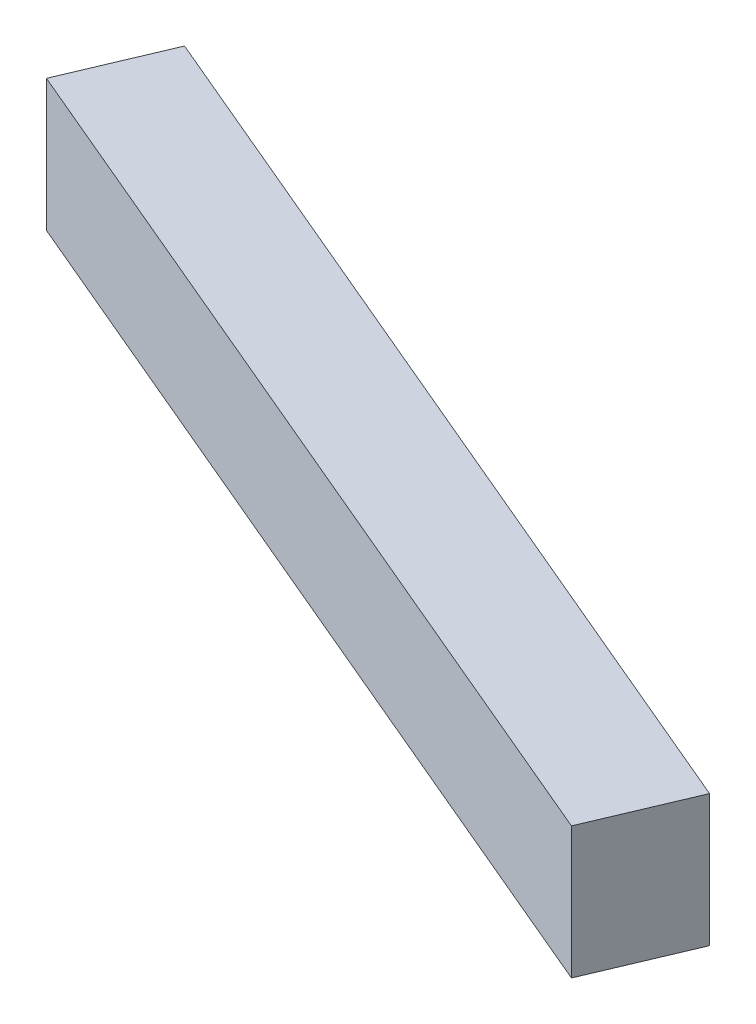
ISO-10303-21;
HEADER;
FILE_DESCRIPTION(('STEP AP214'),'2;1');
FILE_NAME('part.step','',(''),(''),'','','');
FILE_SCHEMA(('AUTOMOTIVE_DESIGN { 1 0 10303 214 1 1 1 1 }'));
ENDSEC;
DATA;
#1=APPLICATION_CONTEXT('core data for automotive mechanical design processes');
#2=APPLICATION_PROTOCOL_DEFINITION('international standard','automotive_design',2000,#1);
#3=PRODUCT_CONTEXT('',#1,'mechanical');
#4=PRODUCT('Part','Part','',(#3));
#5=PRODUCT_RELATED_PRODUCT_CATEGORY('part','',(#4));
#6=PRODUCT_DEFINITION_FORMATION('','',#4);
#7=PRODUCT_DEFINITION_CONTEXT('part definition',#1,'design');
#8=PRODUCT_DEFINITION('design','',#6,#7);
#9=PRODUCT_DEFINITION_SHAPE('','',#8);
#10=(LENGTH_UNIT() NAMED_UNIT(*) SI_UNIT(.MILLI.,.METRE.));
#11=(NAMED_UNIT(*) PLANE_ANGLE_UNIT() SI_UNIT($,.RADIAN.));
#12=(NAMED_UNIT(*) SI_UNIT($,.STERADIAN.) SOLID_ANGLE_UNIT());
#13=UNCERTAINTY_MEASURE_WITH_UNIT(LENGTH_MEASURE(1.E-05),#10,'distance_accuracy_value','');
#14=(GEOMETRIC_REPRESENTATION_CONTEXT(3) GLOBAL_UNCERTAINTY_ASSIGNED_CONTEXT((#13)) GLOBAL_UNIT_ASSIGNED_CONTEXT((#10,
#11,#12)) REPRESENTATION_CONTEXT('',''));
#15=CARTESIAN_POINT('',(0.,0.,0.));
#16=DIRECTION('',(0.,0.,1.));
#17=DIRECTION('',(1.,0.,0.));
#18=AXIS2_PLACEMENT_3D('',#15,#16,#17);
#19=CARTESIAN_POINT('',(16.6153602802194,7.874,6.91890366270433));
#20=DIRECTION('',(-0.389584796007511,0.,0.920990600777112));
#21=DIRECTION('',(0.920990600777112,0.,0.389584796007511));
#22=AXIS2_PLACEMENT_3D('',#19,#20,#21);
#23=PLANE('',#22);
#24=DIRECTION('',(0.,1.,0.));
#25=VECTOR('',#24,1.);
#26=CARTESIAN_POINT('',(16.6153602802194,7.874,6.91890366270433));
#27=LINE('',#26,#25);
#28=CARTESIAN_POINT('',(16.6153602802194,7.62,6.91890366270433));
#29=VERTEX_POINT('',#28);
#30=CARTESIAN_POINT('',(16.6153602802194,7.874,6.91890366270433));
#31=VERTEX_POINT('',#30);
#32=EDGE_CURVE('E20',#29,#31,#27,.T.);
#33=ORIENTED_EDGE('',*,*,#32,.T.);
#34=DIRECTION('',(0.920990600777114,0.,0.389584796007507));
#35=VECTOR('',#34,1.);
#36=CARTESIAN_POINT('',(16.6153602802194,7.874,6.91890366270433));
#37=LINE('',#36,#35);
#38=CARTESIAN_POINT('',(18.3698473746998,7.874,7.66106269909863));
#39=VERTEX_POINT('',#38);
#40=EDGE_CURVE('E55',#31,#39,#37,.T.);
#41=ORIENTED_EDGE('',*,*,#40,.T.);
#42=DIRECTION('',(0.,1.,0.));
#43=VECTOR('',#42,1.);
#44=CARTESIAN_POINT('',(18.3698473746998,7.874,7.66106269909863));
#45=LINE('',#44,#43);
#46=CARTESIAN_POINT('',(18.3698473746998,7.62,7.66106269909863));
#47=VERTEX_POINT('',#46);
#48=EDGE_CURVE('E76',#39,#47,#45,.F.);
#49=ORIENTED_EDGE('',*,*,#48,.T.);
#50=DIRECTION('',(0.920990600777114,0.,0.389584796007507));
#51=VECTOR('',#50,1.);
#52=CARTESIAN_POINT('',(16.6153602802194,7.62,6.91890366270433));
#53=LINE('',#52,#51);
#54=EDGE_CURVE('E58',#29,#47,#53,.T.);
#55=ORIENTED_EDGE('',*,*,#54,.F.);
#56=EDGE_LOOP('',(#33,#41,#49,#55));
#57=FACE_BOUND('',#56,.T.);
#58=ADVANCED_FACE('F17',(#57),#23,.F.);
#59=CARTESIAN_POINT('',(16.6153602802194,7.874,6.91890366270433));
#60=DIRECTION('',(0.920990600777104,0.,0.389584796007531));
#61=DIRECTION('',(0.389584796007531,0.,-0.920990600777104));
#62=AXIS2_PLACEMENT_3D('',#59,#60,#61);
#63=PLANE('',#62);
#64=DIRECTION('',(0.,1.,0.));
#65=VECTOR('',#64,1.);
#66=CARTESIAN_POINT('',(16.5361966496707,7.874,7.10604895278224));
#67=LINE('',#66,#65);
#68=CARTESIAN_POINT('',(16.5361966496707,7.62,7.10604895278224));
#69=VERTEX_POINT('',#68);
#70=CARTESIAN_POINT('',(16.5361966496707,7.874,7.10604895278224));
#71=VERTEX_POINT('',#70);
#72=EDGE_CURVE('E73',#69,#71,#67,.T.);
#73=ORIENTED_EDGE('',*,*,#72,.T.);
#74=DIRECTION('',(0.389584796007401,0.,-0.920990600777159));
#75=VECTOR('',#74,1.);
#76=CARTESIAN_POINT('',(16.5361966496707,7.874,7.10604895278224));
#77=LINE('',#76,#75);
#78=EDGE_CURVE('E63',#71,#31,#77,.T.);
#79=ORIENTED_EDGE('',*,*,#78,.T.);
#80=ORIENTED_EDGE('',*,*,#32,.F.);
#81=DIRECTION('',(0.389584796007401,0.,-0.920990600777159));
#82=VECTOR('',#81,1.);
#83=CARTESIAN_POINT('',(16.5361966496707,7.62,7.10604895278224));
#84=LINE('',#83,#82);
#85=EDGE_CURVE('E80',#69,#29,#84,.T.);
#86=ORIENTED_EDGE('',*,*,#85,.F.);
#87=EDGE_LOOP('',(#73,#79,#80,#86));
#88=FACE_BOUND('',#87,.T.);
#89=ADVANCED_FACE('F72',(#88),#63,.F.);
#90=CARTESIAN_POINT('',(16.6153602802194,7.874,6.91890366270433));
#91=DIRECTION('',(0.,-1.,0.));
#92=DIRECTION('',(0.,0.,-1.));
#93=AXIS2_PLACEMENT_3D('',#90,#91,#92);
#94=PLANE('',#93);
#95=ORIENTED_EDGE('',*,*,#78,.F.);
#96=DIRECTION('',(-0.920990600777112,0.,-0.389584796007512));
#97=VECTOR('',#96,1.);
#98=CARTESIAN_POINT('',(16.5361966496707,7.874,7.10604895278224));
#99=LINE('',#98,#97);
#100=CARTESIAN_POINT('',(18.290683744436,7.874,7.84820798929706));
#101=VERTEX_POINT('',#100);
#102=EDGE_CURVE('E83',#71,#101,#99,.F.);
#103=ORIENTED_EDGE('',*,*,#102,.T.);
#104=DIRECTION('',(-0.389584794605442,0.,0.920990601370196));
#105=VECTOR('',#104,1.);
#106=CARTESIAN_POINT('',(18.3698473746998,7.874,7.66106269909863));
#107=LINE('',#106,#105);
#108=EDGE_CURVE('E69',#101,#39,#107,.F.);
#109=ORIENTED_EDGE('',*,*,#108,.T.);
#110=ORIENTED_EDGE('',*,*,#40,.F.);
#111=EDGE_LOOP('',(#95,#103,#109,#110));
#112=FACE_BOUND('',#111,.T.);
#113=ADVANCED_FACE('F66',(#112),#94,.F.);
#114=CARTESIAN_POINT('',(18.3698473746998,7.874,7.66106269909863));
#115=DIRECTION('',(-0.920990601370196,0.,-0.389584794605442));
#116=DIRECTION('',(-0.389584794605442,0.,0.920990601370196));
#117=AXIS2_PLACEMENT_3D('',#114,#115,#116);
#118=PLANE('',#117);
#119=ORIENTED_EDGE('',*,*,#48,.F.);
#120=ORIENTED_EDGE('',*,*,#108,.F.);
#121=DIRECTION('',(0.,1.,0.));
#122=VECTOR('',#121,1.);
#123=CARTESIAN_POINT('',(18.290683744436,7.874,7.84820798929706));
#124=LINE('',#123,#122);
#125=CARTESIAN_POINT('',(18.290683744436,7.62,7.84820798929706));
#126=VERTEX_POINT('',#125);
#127=EDGE_CURVE('E26',#101,#126,#124,.F.);
#128=ORIENTED_EDGE('',*,*,#127,.T.);
#129=DIRECTION('',(-0.389584794605322,0.,0.920990601370247));
#130=VECTOR('',#129,1.);
#131=CARTESIAN_POINT('',(18.3698473746998,7.62,7.66106269909863));
#132=LINE('',#131,#130);
#133=EDGE_CURVE('E34',#47,#126,#132,.T.);
#134=ORIENTED_EDGE('',*,*,#133,.F.);
#135=EDGE_LOOP('',(#119,#120,#128,#134));
#136=FACE_BOUND('',#135,.T.);
#137=ADVANCED_FACE('F88',(#136),#118,.F.);
#138=CARTESIAN_POINT('',(16.6153602802194,7.62,6.91890366270433));
#139=DIRECTION('',(0.,-1.,0.));
#140=DIRECTION('',(0.,0.,-1.));
#141=AXIS2_PLACEMENT_3D('',#138,#139,#140);
#142=PLANE('',#141);
#143=DIRECTION('',(-0.920990600777112,0.,-0.389584796007512));
#144=VECTOR('',#143,1.);
#145=CARTESIAN_POINT('',(16.5361966496707,7.62,7.10604895278224));
#146=LINE('',#145,#144);
#147=EDGE_CURVE('E11',#126,#69,#146,.T.);
#148=ORIENTED_EDGE('',*,*,#147,.T.);
#149=ORIENTED_EDGE('',*,*,#85,.T.);
#150=ORIENTED_EDGE('',*,*,#54,.T.);
#151=ORIENTED_EDGE('',*,*,#133,.T.);
#152=EDGE_LOOP('',(#148,#149,#150,#151));
#153=FACE_BOUND('',#152,.T.);
#154=ADVANCED_FACE('F91',(#153),#142,.T.);
#155=CARTESIAN_POINT('',(16.5361966496707,7.874,7.10604895278224));
#156=DIRECTION('',(0.389584796007512,0.,-0.920990600777112));
#157=DIRECTION('',(-0.920990600777112,0.,-0.389584796007512));
#158=AXIS2_PLACEMENT_3D('',#155,#156,#157);
#159=PLANE('',#158);
#160=ORIENTED_EDGE('',*,*,#127,.F.);
#161=ORIENTED_EDGE('',*,*,#102,.F.);
#162=ORIENTED_EDGE('',*,*,#72,.F.);
#163=ORIENTED_EDGE('',*,*,#147,.F.);
#164=EDGE_LOOP('',(#160,#161,#162,#163));
#165=FACE_BOUND('',#164,.T.);
#166=ADVANCED_FACE('F90',(#165),#159,.F.);
#167=CLOSED_SHELL('',(#58,#89,#113,#137,#154,#166));
#168=MANIFOLD_SOLID_BREP('B1',#167);
#169=ADVANCED_BREP_SHAPE_REPRESENTATION('',(#18,#168),#14);
#170=SHAPE_DEFINITION_REPRESENTATION(#9,#169);
ENDSEC;
END-ISO-10303-21;
